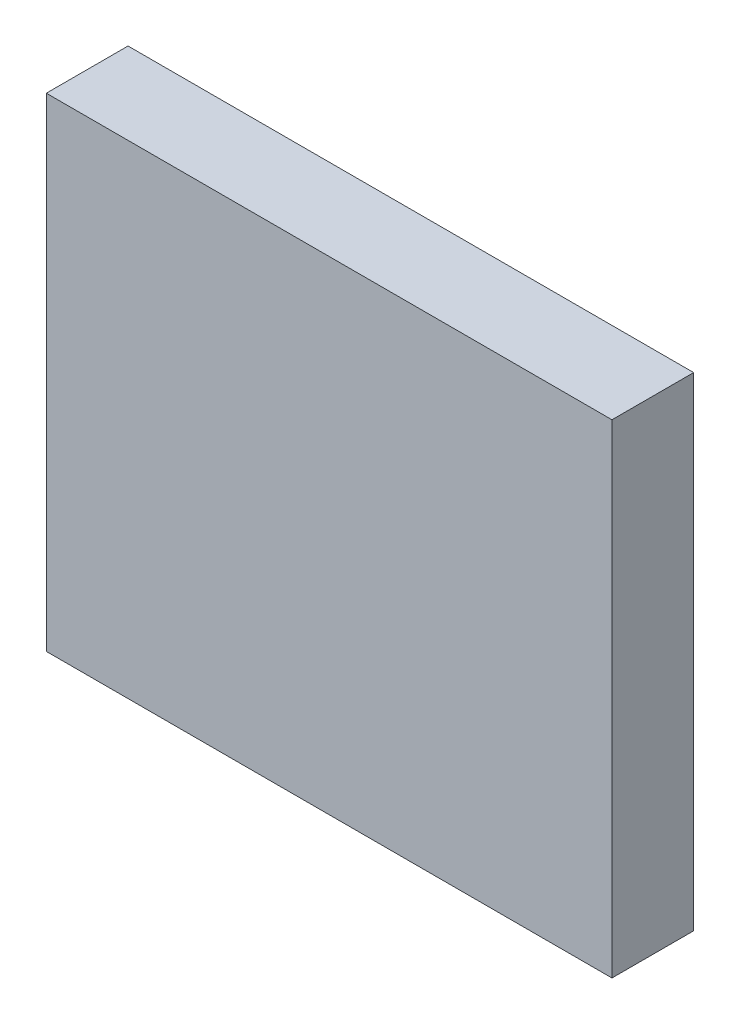
ISO-10303-21;
HEADER;
FILE_DESCRIPTION(('STEP AP214'),'2;1');
FILE_NAME('part.step','',(''),(''),'','','');
FILE_SCHEMA(('AUTOMOTIVE_DESIGN { 1 0 10303 214 1 1 1 1 }'));
ENDSEC;
DATA;
#1=APPLICATION_CONTEXT('core data for automotive mechanical design processes');
#2=APPLICATION_PROTOCOL_DEFINITION('international standard','automotive_design',2000,#1);
#3=PRODUCT_CONTEXT('',#1,'mechanical');
#4=PRODUCT('Part','Part','',(#3));
#5=PRODUCT_RELATED_PRODUCT_CATEGORY('part','',(#4));
#6=PRODUCT_DEFINITION_FORMATION('','',#4);
#7=PRODUCT_DEFINITION_CONTEXT('part definition',#1,'design');
#8=PRODUCT_DEFINITION('design','',#6,#7);
#9=PRODUCT_DEFINITION_SHAPE('','',#8);
#10=(LENGTH_UNIT() NAMED_UNIT(*) SI_UNIT(.MILLI.,.METRE.));
#11=(NAMED_UNIT(*) PLANE_ANGLE_UNIT() SI_UNIT($,.RADIAN.));
#12=(NAMED_UNIT(*) SI_UNIT($,.STERADIAN.) SOLID_ANGLE_UNIT());
#13=UNCERTAINTY_MEASURE_WITH_UNIT(LENGTH_MEASURE(1.E-05),#10,'distance_accuracy_value','');
#14=(GEOMETRIC_REPRESENTATION_CONTEXT(3) GLOBAL_UNCERTAINTY_ASSIGNED_CONTEXT((#13)) GLOBAL_UNIT_ASSIGNED_CONTEXT((#10,
#11,#12)) REPRESENTATION_CONTEXT('',''));
#15=CARTESIAN_POINT('',(0.,0.,0.));
#16=DIRECTION('',(0.,0.,1.));
#17=DIRECTION('',(1.,0.,0.));
#18=AXIS2_PLACEMENT_3D('',#15,#16,#17);
#19=CARTESIAN_POINT('',(-3.6195,-2.6924,1.));
#20=DIRECTION('',(1.,0.,0.));
#21=DIRECTION('',(0.,0.,-1.));
#22=AXIS2_PLACEMENT_3D('',#19,#20,#21);
#23=PLANE('',#22);
#24=DIRECTION('',(0.,-1.,0.));
#25=VECTOR('',#24,1.);
#26=CARTESIAN_POINT('',(-3.6195,-2.6924,0.));
#27=LINE('',#26,#25);
#28=CARTESIAN_POINT('',(-3.6195,3.223259,0.));
#29=VERTEX_POINT('',#28);
#30=CARTESIAN_POINT('',(-3.6195,-2.6924,0.));
#31=VERTEX_POINT('',#30);
#32=EDGE_CURVE('E96',#29,#31,#27,.T.);
#33=ORIENTED_EDGE('',*,*,#32,.T.);
#34=DIRECTION('',(0.,0.,-1.));
#35=VECTOR('',#34,1.);
#36=CARTESIAN_POINT('',(-3.6195,-2.6924,1.));
#37=LINE('',#36,#35);
#38=CARTESIAN_POINT('',(-3.6195,-2.6924,1.));
#39=VERTEX_POINT('',#38);
#40=EDGE_CURVE('E11',#39,#31,#37,.T.);
#41=ORIENTED_EDGE('',*,*,#40,.F.);
#42=DIRECTION('',(0.,-1.,0.));
#43=VECTOR('',#42,1.);
#44=CARTESIAN_POINT('',(-3.6195,-2.6924,1.));
#45=LINE('',#44,#43);
#46=CARTESIAN_POINT('',(-3.6195,3.223259,1.));
#47=VERTEX_POINT('',#46);
#48=EDGE_CURVE('E84',#47,#39,#45,.T.);
#49=ORIENTED_EDGE('',*,*,#48,.F.);
#50=DIRECTION('',(0.,0.,-1.));
#51=VECTOR('',#50,1.);
#52=CARTESIAN_POINT('',(-3.6195,3.223259,1.));
#53=LINE('',#52,#51);
#54=EDGE_CURVE('E92',#47,#29,#53,.T.);
#55=ORIENTED_EDGE('',*,*,#54,.T.);
#56=EDGE_LOOP('',(#33,#41,#49,#55));
#57=FACE_BOUND('',#56,.T.);
#58=ADVANCED_FACE('F33',(#57),#23,.F.);
#59=CARTESIAN_POINT('',(3.302,-2.6924,1.));
#60=DIRECTION('',(0.,1.,0.));
#61=DIRECTION('',(0.,0.,1.));
#62=AXIS2_PLACEMENT_3D('',#59,#60,#61);
#63=PLANE('',#62);
#64=DIRECTION('',(1.,0.,0.));
#65=VECTOR('',#64,1.);
#66=CARTESIAN_POINT('',(3.302,-2.6924,0.));
#67=LINE('',#66,#65);
#68=CARTESIAN_POINT('',(3.302,-2.6924,0.));
#69=VERTEX_POINT('',#68);
#70=EDGE_CURVE('E88',#31,#69,#67,.T.);
#71=ORIENTED_EDGE('',*,*,#70,.T.);
#72=DIRECTION('',(0.,0.,-1.));
#73=VECTOR('',#72,1.);
#74=CARTESIAN_POINT('',(3.302,-2.6924,1.));
#75=LINE('',#74,#73);
#76=CARTESIAN_POINT('',(3.302,-2.6924,1.));
#77=VERTEX_POINT('',#76);
#78=EDGE_CURVE('E41',#77,#69,#75,.T.);
#79=ORIENTED_EDGE('',*,*,#78,.F.);
#80=DIRECTION('',(1.,0.,0.));
#81=VECTOR('',#80,1.);
#82=CARTESIAN_POINT('',(3.302,-2.6924,1.));
#83=LINE('',#82,#81);
#84=EDGE_CURVE('E79',#39,#77,#83,.T.);
#85=ORIENTED_EDGE('',*,*,#84,.F.);
#86=ORIENTED_EDGE('',*,*,#40,.T.);
#87=EDGE_LOOP('',(#71,#79,#85,#86));
#88=FACE_BOUND('',#87,.T.);
#89=ADVANCED_FACE('F87',(#88),#63,.F.);
#90=CARTESIAN_POINT('',(3.302,3.223259,1.));
#91=DIRECTION('',(-1.,0.,0.));
#92=DIRECTION('',(0.,0.,1.));
#93=AXIS2_PLACEMENT_3D('',#90,#91,#92);
#94=PLANE('',#93);
#95=DIRECTION('',(0.,1.,0.));
#96=VECTOR('',#95,1.);
#97=CARTESIAN_POINT('',(3.302,3.223259,0.));
#98=LINE('',#97,#96);
#99=CARTESIAN_POINT('',(3.302,3.223259,0.));
#100=VERTEX_POINT('',#99);
#101=EDGE_CURVE('E66',#69,#100,#98,.T.);
#102=ORIENTED_EDGE('',*,*,#101,.T.);
#103=DIRECTION('',(0.,0.,-1.));
#104=VECTOR('',#103,1.);
#105=CARTESIAN_POINT('',(3.302,3.223259,1.));
#106=LINE('',#105,#104);
#107=CARTESIAN_POINT('',(3.302,3.223259,1.));
#108=VERTEX_POINT('',#107);
#109=EDGE_CURVE('E89',#108,#100,#106,.T.);
#110=ORIENTED_EDGE('',*,*,#109,.F.);
#111=DIRECTION('',(0.,1.,0.));
#112=VECTOR('',#111,1.);
#113=CARTESIAN_POINT('',(3.302,3.223259,1.));
#114=LINE('',#113,#112);
#115=EDGE_CURVE('E82',#77,#108,#114,.T.);
#116=ORIENTED_EDGE('',*,*,#115,.F.);
#117=ORIENTED_EDGE('',*,*,#78,.T.);
#118=EDGE_LOOP('',(#102,#110,#116,#117));
#119=FACE_BOUND('',#118,.T.);
#120=ADVANCED_FACE('F90',(#119),#94,.F.);
#121=CARTESIAN_POINT('',(-3.6195,3.223259,1.));
#122=DIRECTION('',(0.,-1.,0.));
#123=DIRECTION('',(0.,0.,-1.));
#124=AXIS2_PLACEMENT_3D('',#121,#122,#123);
#125=PLANE('',#124);
#126=DIRECTION('',(-1.,0.,0.));
#127=VECTOR('',#126,1.);
#128=CARTESIAN_POINT('',(-3.6195,3.223259,0.));
#129=LINE('',#128,#127);
#130=EDGE_CURVE('E72',#100,#29,#129,.T.);
#131=ORIENTED_EDGE('',*,*,#130,.T.);
#132=ORIENTED_EDGE('',*,*,#54,.F.);
#133=DIRECTION('',(-1.,0.,0.));
#134=VECTOR('',#133,1.);
#135=CARTESIAN_POINT('',(-3.6195,3.223259,1.));
#136=LINE('',#135,#134);
#137=EDGE_CURVE('E49',#108,#47,#136,.T.);
#138=ORIENTED_EDGE('',*,*,#137,.F.);
#139=ORIENTED_EDGE('',*,*,#109,.T.);
#140=EDGE_LOOP('',(#131,#132,#138,#139));
#141=FACE_BOUND('',#140,.T.);
#142=ADVANCED_FACE('F103',(#141),#125,.F.);
#143=CARTESIAN_POINT('',(0.,0.,1.));
#144=DIRECTION('',(0.,0.,-1.));
#145=DIRECTION('',(-1.,0.,0.));
#146=AXIS2_PLACEMENT_3D('',#143,#144,#145);
#147=PLANE('',#146);
#148=ORIENTED_EDGE('',*,*,#48,.T.);
#149=ORIENTED_EDGE('',*,*,#84,.T.);
#150=ORIENTED_EDGE('',*,*,#115,.T.);
#151=ORIENTED_EDGE('',*,*,#137,.T.);
#152=EDGE_LOOP('',(#148,#149,#150,#151));
#153=FACE_BOUND('',#152,.T.);
#154=ADVANCED_FACE('F80',(#153),#147,.F.);
#155=CARTESIAN_POINT('',(0.,0.,0.));
#156=DIRECTION('',(0.,0.,-1.));
#157=DIRECTION('',(-1.,0.,0.));
#158=AXIS2_PLACEMENT_3D('',#155,#156,#157);
#159=PLANE('',#158);
#160=ORIENTED_EDGE('',*,*,#32,.F.);
#161=ORIENTED_EDGE('',*,*,#130,.F.);
#162=ORIENTED_EDGE('',*,*,#101,.F.);
#163=ORIENTED_EDGE('',*,*,#70,.F.);
#164=EDGE_LOOP('',(#160,#161,#162,#163));
#165=FACE_BOUND('',#164,.T.);
#166=ADVANCED_FACE('F106',(#165),#159,.T.);
#167=CLOSED_SHELL('',(#58,#89,#120,#142,#154,#166));
#168=MANIFOLD_SOLID_BREP('B2',#167);
#169=ADVANCED_BREP_SHAPE_REPRESENTATION('',(#18,#168),#14);
#170=SHAPE_DEFINITION_REPRESENTATION(#9,#169);
ENDSEC;
END-ISO-10303-21;
